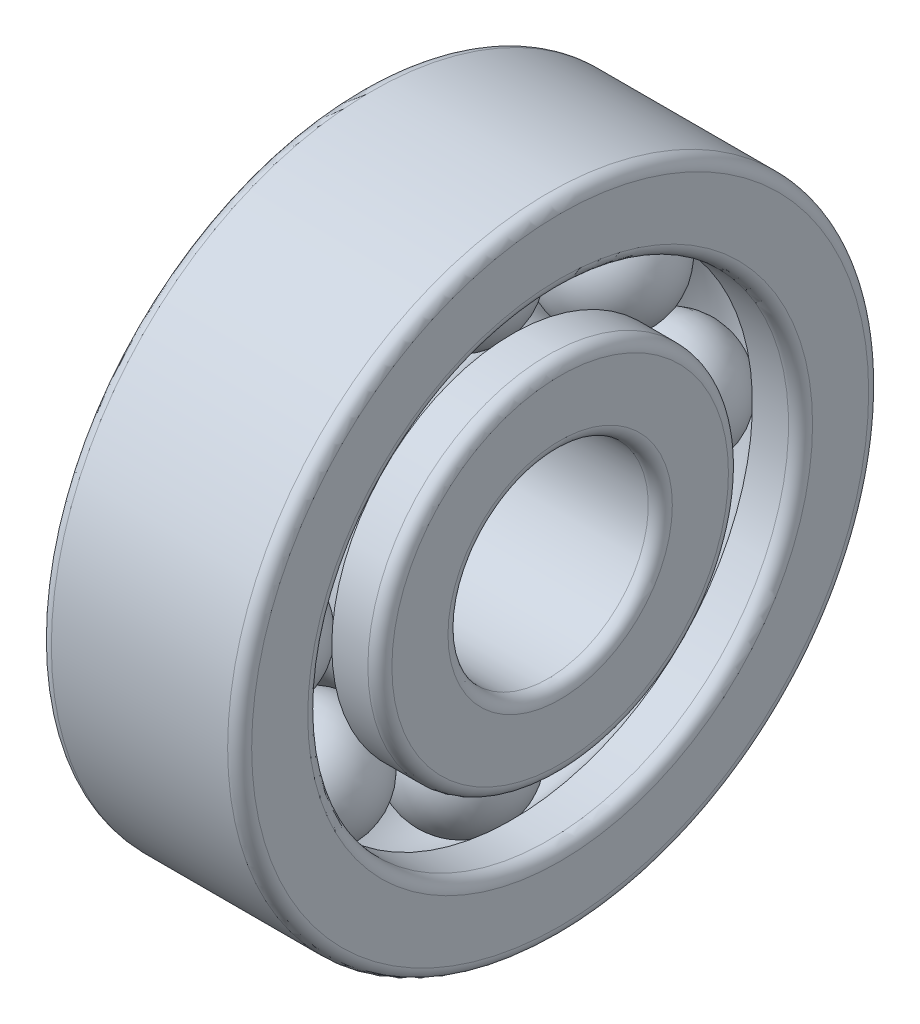
ISO-10303-21;
HEADER;
FILE_DESCRIPTION(('STEP AP214'),'2;1');
FILE_NAME('part.step','',(''),(''),'','','');
FILE_SCHEMA(('AUTOMOTIVE_DESIGN { 1 0 10303 214 1 1 1 1 }'));
ENDSEC;
DATA;
#1=APPLICATION_CONTEXT('core data for automotive mechanical design processes');
#2=APPLICATION_PROTOCOL_DEFINITION('international standard','automotive_design',2000,#1);
#3=PRODUCT_CONTEXT('',#1,'mechanical');
#4=PRODUCT('Part','Part','',(#3));
#5=PRODUCT_RELATED_PRODUCT_CATEGORY('part','',(#4));
#6=PRODUCT_DEFINITION_FORMATION('','',#4);
#7=PRODUCT_DEFINITION_CONTEXT('part definition',#1,'design');
#8=PRODUCT_DEFINITION('design','',#6,#7);
#9=PRODUCT_DEFINITION_SHAPE('','',#8);
#10=(LENGTH_UNIT() NAMED_UNIT(*) SI_UNIT(.MILLI.,.METRE.));
#11=(NAMED_UNIT(*) PLANE_ANGLE_UNIT() SI_UNIT($,.RADIAN.));
#12=(NAMED_UNIT(*) SI_UNIT($,.STERADIAN.) SOLID_ANGLE_UNIT());
#13=UNCERTAINTY_MEASURE_WITH_UNIT(LENGTH_MEASURE(1.E-05),#10,'distance_accuracy_value','');
#14=(GEOMETRIC_REPRESENTATION_CONTEXT(3) GLOBAL_UNCERTAINTY_ASSIGNED_CONTEXT((#13)) GLOBAL_UNIT_ASSIGNED_CONTEXT((#10,
#11,#12)) REPRESENTATION_CONTEXT('',''));
#15=CARTESIAN_POINT('',(0.,0.,0.));
#16=DIRECTION('',(0.,0.,1.));
#17=DIRECTION('',(1.,0.,0.));
#18=AXIS2_PLACEMENT_3D('',#15,#16,#17);
#19=CARTESIAN_POINT('',(0.,0.,5.25));
#20=DIRECTION('',(0.,0.,1.));
#21=DIRECTION('',(0.,-1.,0.));
#22=AXIS2_PLACEMENT_3D('',#19,#20,#21);
#23=SPHERICAL_SURFACE('',#22,1.5);
#24=CARTESIAN_POINT('',(0.,0.,6.75));
#25=VERTEX_POINT('',#24);
#26=VERTEX_LOOP('',#25);
#27=FACE_BOUND('',#26,.T.);
#28=CARTESIAN_POINT('',(0.,0.,3.75));
#29=VERTEX_POINT('',#28);
#30=VERTEX_LOOP('',#29);
#31=FACE_BOUND('',#30,.T.);
#32=ADVANCED_FACE('P0_F15',(#27,#31),#23,.T.);
#33=CLOSED_SHELL('',(#32));
#34=MANIFOLD_SOLID_BREP('P0_B1',#33);
#35=CARTESIAN_POINT('',(0.,0.,0.));
#36=DIRECTION('',(-1.,0.,0.));
#37=DIRECTION('',(0.,0.,1.));
#38=AXIS2_PLACEMENT_3D('',#35,#36,#37);
#39=TOROIDAL_SURFACE('',#38,5.25,1.5);
#40=CARTESIAN_POINT('',(-1.29903810567666,0.,0.));
#41=DIRECTION('',(-1.,0.,0.));
#42=DIRECTION('',(0.,0.,1.));
#43=AXIS2_PLACEMENT_3D('',#40,#41,#42);
#44=CIRCLE('',#43,4.5);
#45=CARTESIAN_POINT('',(-1.29903810567666,0.,4.5));
#46=VERTEX_POINT('',#45);
#47=EDGE_CURVE('P1_E128',#46,#46,#44,.T.);
#48=ORIENTED_EDGE('',*,*,#47,.F.);
#49=EDGE_LOOP('',(#48));
#50=FACE_BOUND('',#49,.T.);
#51=CARTESIAN_POINT('',(1.29903810567666,0.,0.));
#52=DIRECTION('',(-1.,0.,0.));
#53=DIRECTION('',(0.,0.,1.));
#54=AXIS2_PLACEMENT_3D('',#51,#52,#53);
#55=CIRCLE('',#54,4.5);
#56=CARTESIAN_POINT('',(1.29903810567666,0.,4.5));
#57=VERTEX_POINT('',#56);
#58=EDGE_CURVE('P1_E123',#57,#57,#55,.F.);
#59=ORIENTED_EDGE('',*,*,#58,.F.);
#60=EDGE_LOOP('',(#59));
#61=FACE_BOUND('',#60,.T.);
#62=ADVANCED_FACE('P1_F16',(#50,#61),#39,.F.);
#63=CARTESIAN_POINT('',(-4.15496409017378,0.,0.));
#64=DIRECTION('',(-1.,0.,0.));
#65=DIRECTION('',(0.,0.,1.));
#66=AXIS2_PLACEMENT_3D('',#63,#64,#65);
#67=CYLINDRICAL_SURFACE('',#66,4.5);
#68=ORIENTED_EDGE('',*,*,#47,.T.);
#69=EDGE_LOOP('',(#68));
#70=FACE_BOUND('',#69,.T.);
#71=CARTESIAN_POINT('',(-2.2,0.,0.));
#72=DIRECTION('',(1.,0.,0.));
#73=DIRECTION('',(0.,0.,-1.));
#74=AXIS2_PLACEMENT_3D('',#71,#72,#73);
#75=CIRCLE('',#74,4.5);
#76=CARTESIAN_POINT('',(-2.2,0.,-4.5));
#77=VERTEX_POINT('',#76);
#78=EDGE_CURVE('P1_E121',#77,#77,#75,.F.);
#79=ORIENTED_EDGE('',*,*,#78,.F.);
#80=EDGE_LOOP('',(#79));
#81=FACE_BOUND('',#80,.T.);
#82=ADVANCED_FACE('P1_F224',(#70,#81),#67,.T.);
#83=CARTESIAN_POINT('',(-4.15496409017378,0.,0.));
#84=DIRECTION('',(-1.,0.,0.));
#85=DIRECTION('',(0.,0.,1.));
#86=AXIS2_PLACEMENT_3D('',#83,#84,#85);
#87=CYLINDRICAL_SURFACE('',#86,4.5);
#88=CARTESIAN_POINT('',(2.2,0.,0.));
#89=DIRECTION('',(-1.,0.,0.));
#90=DIRECTION('',(0.,0.,1.));
#91=AXIS2_PLACEMENT_3D('',#88,#89,#90);
#92=CIRCLE('',#91,4.5);
#93=CARTESIAN_POINT('',(2.2,0.,4.5));
#94=VERTEX_POINT('',#93);
#95=EDGE_CURVE('P1_E70',#94,#94,#92,.F.);
#96=ORIENTED_EDGE('',*,*,#95,.F.);
#97=EDGE_LOOP('',(#96));
#98=FACE_BOUND('',#97,.T.);
#99=ORIENTED_EDGE('',*,*,#58,.T.);
#100=EDGE_LOOP('',(#99));
#101=FACE_BOUND('',#100,.T.);
#102=ADVANCED_FACE('P1_F221',(#98,#101),#87,.T.);
#103=CARTESIAN_POINT('',(-2.2,0.,0.));
#104=DIRECTION('',(1.,0.,0.));
#105=DIRECTION('',(0.,0.,-1.));
#106=AXIS2_PLACEMENT_3D('',#103,#104,#105);
#107=TOROIDAL_SURFACE('',#106,4.2,0.3);
#108=CARTESIAN_POINT('',(-2.5,0.,0.));
#109=DIRECTION('',(1.,0.,0.));
#110=DIRECTION('',(0.,0.,-1.));
#111=AXIS2_PLACEMENT_3D('',#108,#109,#110);
#112=CIRCLE('',#111,4.2);
#113=CARTESIAN_POINT('',(-2.5,0.,-4.2));
#114=VERTEX_POINT('',#113);
#115=CARTESIAN_POINT('',(-2.5,0.,4.2));
#116=VERTEX_POINT('',#115);
#117=EDGE_CURVE('P1_E57',#114,#116,#112,.T.);
#118=ORIENTED_EDGE('',*,*,#117,.T.);
#119=CARTESIAN_POINT('',(-2.5,0.,0.));
#120=DIRECTION('',(1.,0.,0.));
#121=DIRECTION('',(0.,0.,1.));
#122=AXIS2_PLACEMENT_3D('',#119,#120,#121);
#123=CIRCLE('',#122,4.2);
#124=EDGE_CURVE('P1_E60',#116,#114,#123,.T.);
#125=ORIENTED_EDGE('',*,*,#124,.T.);
#126=EDGE_LOOP('',(#118,#125));
#127=FACE_BOUND('',#126,.T.);
#128=ORIENTED_EDGE('',*,*,#78,.T.);
#129=EDGE_LOOP('',(#128));
#130=FACE_BOUND('',#129,.T.);
#131=ADVANCED_FACE('P1_F68',(#127,#130),#107,.T.);
#132=CARTESIAN_POINT('',(2.2,0.,0.));
#133=DIRECTION('',(-1.,0.,0.));
#134=DIRECTION('',(0.,0.,1.));
#135=AXIS2_PLACEMENT_3D('',#132,#133,#134);
#136=TOROIDAL_SURFACE('',#135,4.2,0.3);
#137=CARTESIAN_POINT('',(2.5,0.,0.));
#138=DIRECTION('',(-1.,0.,0.));
#139=DIRECTION('',(0.,0.,1.));
#140=AXIS2_PLACEMENT_3D('',#137,#138,#139);
#141=CIRCLE('',#140,4.2);
#142=CARTESIAN_POINT('',(2.5,0.,4.2));
#143=VERTEX_POINT('',#142);
#144=CARTESIAN_POINT('',(2.5,0.,-4.2));
#145=VERTEX_POINT('',#144);
#146=EDGE_CURVE('P1_E161',#143,#145,#141,.T.);
#147=ORIENTED_EDGE('',*,*,#146,.T.);
#148=CARTESIAN_POINT('',(2.5,0.,0.));
#149=DIRECTION('',(-1.,0.,0.));
#150=DIRECTION('',(0.,0.,-1.));
#151=AXIS2_PLACEMENT_3D('',#148,#149,#150);
#152=CIRCLE('',#151,4.2);
#153=EDGE_CURVE('P1_E101',#145,#143,#152,.T.);
#154=ORIENTED_EDGE('',*,*,#153,.T.);
#155=EDGE_LOOP('',(#147,#154));
#156=FACE_BOUND('',#155,.T.);
#157=ORIENTED_EDGE('',*,*,#95,.T.);
#158=EDGE_LOOP('',(#157));
#159=FACE_BOUND('',#158,.T.);
#160=ADVANCED_FACE('P1_F78',(#156,#159),#136,.T.);
#161=CARTESIAN_POINT('',(-2.5,2.5,0.));
#162=DIRECTION('',(1.,0.,0.));
#163=DIRECTION('',(0.,0.,-1.));
#164=AXIS2_PLACEMENT_3D('',#161,#162,#163);
#165=PLANE('',#164);
#166=CARTESIAN_POINT('',(-2.5,0.,0.));
#167=DIRECTION('',(-1.,0.,0.));
#168=DIRECTION('',(0.,0.,-1.));
#169=AXIS2_PLACEMENT_3D('',#166,#167,#168);
#170=CIRCLE('',#169,2.8);
#171=CARTESIAN_POINT('',(-2.5,0.,-2.8));
#172=VERTEX_POINT('',#171);
#173=CARTESIAN_POINT('',(-2.5,0.,2.8));
#174=VERTEX_POINT('',#173);
#175=EDGE_CURVE('P1_E215',#172,#174,#170,.T.);
#176=ORIENTED_EDGE('',*,*,#175,.F.);
#177=CARTESIAN_POINT('',(-2.5,0.,0.));
#178=DIRECTION('',(-1.,0.,0.));
#179=DIRECTION('',(0.,0.,1.));
#180=AXIS2_PLACEMENT_3D('',#177,#178,#179);
#181=CIRCLE('',#180,2.8);
#182=EDGE_CURVE('P1_E65',#174,#172,#181,.T.);
#183=ORIENTED_EDGE('',*,*,#182,.F.);
#184=EDGE_LOOP('',(#176,#183));
#185=FACE_BOUND('',#184,.T.);
#186=ORIENTED_EDGE('',*,*,#117,.F.);
#187=ORIENTED_EDGE('',*,*,#124,.F.);
#188=EDGE_LOOP('',(#186,#187));
#189=FACE_BOUND('',#188,.T.);
#190=ADVANCED_FACE('P1_F62',(#185,#189),#165,.F.);
#191=CARTESIAN_POINT('',(2.5,2.5,0.));
#192=DIRECTION('',(-1.,0.,0.));
#193=DIRECTION('',(0.,0.,1.));
#194=AXIS2_PLACEMENT_3D('',#191,#192,#193);
#195=PLANE('',#194);
#196=CARTESIAN_POINT('',(2.5,0.,0.));
#197=DIRECTION('',(1.,0.,0.));
#198=DIRECTION('',(0.,0.,1.));
#199=AXIS2_PLACEMENT_3D('',#196,#197,#198);
#200=CIRCLE('',#199,2.8);
#201=CARTESIAN_POINT('',(2.5,0.,2.8));
#202=VERTEX_POINT('',#201);
#203=CARTESIAN_POINT('',(2.5,0.,-2.8));
#204=VERTEX_POINT('',#203);
#205=EDGE_CURVE('P1_E181',#202,#204,#200,.T.);
#206=ORIENTED_EDGE('',*,*,#205,.F.);
#207=CARTESIAN_POINT('',(2.5,0.,0.));
#208=DIRECTION('',(1.,0.,0.));
#209=DIRECTION('',(0.,0.,-1.));
#210=AXIS2_PLACEMENT_3D('',#207,#208,#209);
#211=CIRCLE('',#210,2.8);
#212=EDGE_CURVE('P1_E36',#204,#202,#211,.T.);
#213=ORIENTED_EDGE('',*,*,#212,.F.);
#214=EDGE_LOOP('',(#206,#213));
#215=FACE_BOUND('',#214,.T.);
#216=ORIENTED_EDGE('',*,*,#146,.F.);
#217=ORIENTED_EDGE('',*,*,#153,.F.);
#218=EDGE_LOOP('',(#216,#217));
#219=FACE_BOUND('',#218,.T.);
#220=ADVANCED_FACE('P1_F149',(#215,#219),#195,.F.);
#221=CARTESIAN_POINT('',(-2.2,0.,0.));
#222=DIRECTION('',(1.,0.,0.));
#223=DIRECTION('',(0.,0.,-1.));
#224=AXIS2_PLACEMENT_3D('',#221,#222,#223);
#225=TOROIDAL_SURFACE('',#224,2.8,0.3);
#226=CARTESIAN_POINT('',(-2.2,0.,0.));
#227=DIRECTION('',(-1.,0.,0.));
#228=DIRECTION('',(0.,0.,1.));
#229=AXIS2_PLACEMENT_3D('',#226,#227,#228);
#230=CIRCLE('',#229,2.5);
#231=CARTESIAN_POINT('',(-2.2,0.,2.5));
#232=VERTEX_POINT('',#231);
#233=EDGE_CURVE('P1_E28',#232,#232,#230,.F.);
#234=ORIENTED_EDGE('',*,*,#233,.T.);
#235=EDGE_LOOP('',(#234));
#236=FACE_BOUND('',#235,.T.);
#237=ORIENTED_EDGE('',*,*,#175,.T.);
#238=ORIENTED_EDGE('',*,*,#182,.T.);
#239=EDGE_LOOP('',(#237,#238));
#240=FACE_BOUND('',#239,.T.);
#241=ADVANCED_FACE('P1_F138',(#236,#240),#225,.T.);
#242=CARTESIAN_POINT('',(2.2,0.,0.));
#243=DIRECTION('',(-1.,0.,0.));
#244=DIRECTION('',(0.,0.,1.));
#245=AXIS2_PLACEMENT_3D('',#242,#243,#244);
#246=TOROIDAL_SURFACE('',#245,2.8,0.3);
#247=ORIENTED_EDGE('',*,*,#205,.T.);
#248=ORIENTED_EDGE('',*,*,#212,.T.);
#249=EDGE_LOOP('',(#247,#248));
#250=FACE_BOUND('',#249,.T.);
#251=CARTESIAN_POINT('',(2.2,0.,0.));
#252=DIRECTION('',(-1.,0.,0.));
#253=DIRECTION('',(0.,0.,1.));
#254=AXIS2_PLACEMENT_3D('',#251,#252,#253);
#255=CIRCLE('',#254,2.5);
#256=CARTESIAN_POINT('',(2.2,0.,2.5));
#257=VERTEX_POINT('',#256);
#258=EDGE_CURVE('P1_E11',#257,#257,#255,.T.);
#259=ORIENTED_EDGE('',*,*,#258,.T.);
#260=EDGE_LOOP('',(#259));
#261=FACE_BOUND('',#260,.T.);
#262=ADVANCED_FACE('P1_F148',(#250,#261),#246,.T.);
#263=CARTESIAN_POINT('',(-4.15496409017378,0.,0.));
#264=DIRECTION('',(-1.,0.,0.));
#265=DIRECTION('',(0.,0.,1.));
#266=AXIS2_PLACEMENT_3D('',#263,#264,#265);
#267=CYLINDRICAL_SURFACE('',#266,2.5);
#268=ORIENTED_EDGE('',*,*,#233,.F.);
#269=EDGE_LOOP('',(#268));
#270=FACE_BOUND('',#269,.T.);
#271=ORIENTED_EDGE('',*,*,#258,.F.);
#272=EDGE_LOOP('',(#271));
#273=FACE_BOUND('',#272,.T.);
#274=ADVANCED_FACE('P1_F235',(#270,#273),#267,.F.);
#275=CLOSED_SHELL('',(#62,#82,#102,#131,#160,#190,#220,#241,#262,#274));
#276=MANIFOLD_SOLID_BREP('P1_B1',#275);
#277=CARTESIAN_POINT('',(0.,-5.25,0.));
#278=DIRECTION('',(0.,-1.,0.));
#279=DIRECTION('',(0.,0.,-1.));
#280=AXIS2_PLACEMENT_3D('',#277,#278,#279);
#281=SPHERICAL_SURFACE('',#280,1.5);
#282=CARTESIAN_POINT('',(0.,-3.75,0.));
#283=VERTEX_POINT('',#282);
#284=VERTEX_LOOP('',#283);
#285=FACE_BOUND('',#284,.T.);
#286=CARTESIAN_POINT('',(0.,-6.75,0.));
#287=VERTEX_POINT('',#286);
#288=VERTEX_LOOP('',#287);
#289=FACE_BOUND('',#288,.T.);
#290=ADVANCED_FACE('P2_F15',(#285,#289),#281,.T.);
#291=CLOSED_SHELL('',(#290));
#292=MANIFOLD_SOLID_BREP('P2_B1',#291);
#293=CARTESIAN_POINT('',(0.,0.,-5.25));
#294=DIRECTION('',(0.,0.,-1.));
#295=DIRECTION('',(0.,1.,0.));
#296=AXIS2_PLACEMENT_3D('',#293,#294,#295);
#297=SPHERICAL_SURFACE('',#296,1.5);
#298=CARTESIAN_POINT('',(0.,0.,-6.75));
#299=VERTEX_POINT('',#298);
#300=VERTEX_LOOP('',#299);
#301=FACE_BOUND('',#300,.T.);
#302=CARTESIAN_POINT('',(0.,0.,-3.75));
#303=VERTEX_POINT('',#302);
#304=VERTEX_LOOP('',#303);
#305=FACE_BOUND('',#304,.T.);
#306=ADVANCED_FACE('P3_F15',(#301,#305),#297,.T.);
#307=CLOSED_SHELL('',(#306));
#308=MANIFOLD_SOLID_BREP('P3_B1',#307);
#309=CARTESIAN_POINT('',(0.,-3.71231060122939,3.71231060122936));
#310=DIRECTION('',(0.,-0.707106781186551,0.707106781186544));
#311=DIRECTION('',(0.,-0.707106781186544,-0.707106781186551));
#312=AXIS2_PLACEMENT_3D('',#309,#310,#311);
#313=SPHERICAL_SURFACE('',#312,1.5);
#314=CARTESIAN_POINT('',(0.,-2.65165042944956,2.65165042944954));
#315=VERTEX_POINT('',#314);
#316=VERTEX_LOOP('',#315);
#317=FACE_BOUND('',#316,.T.);
#318=CARTESIAN_POINT('',(0.,-4.77297077300922,4.77297077300917));
#319=VERTEX_POINT('',#318);
#320=VERTEX_LOOP('',#319);
#321=FACE_BOUND('',#320,.T.);
#322=ADVANCED_FACE('P4_F15',(#317,#321),#313,.T.);
#323=CLOSED_SHELL('',(#322));
#324=MANIFOLD_SOLID_BREP('P4_B1',#323);
#325=CARTESIAN_POINT('',(0.,3.71231060122937,3.71231060122938));
#326=DIRECTION('',(0.,0.707106781186546,0.707106781186549));
#327=DIRECTION('',(0.,-0.707106781186549,0.707106781186546));
#328=AXIS2_PLACEMENT_3D('',#325,#326,#327);
#329=SPHERICAL_SURFACE('',#328,1.5);
#330=CARTESIAN_POINT('',(0.,4.77297077300919,4.7729707730092));
#331=VERTEX_POINT('',#330);
#332=VERTEX_LOOP('',#331);
#333=FACE_BOUND('',#332,.T.);
#334=CARTESIAN_POINT('',(0.,2.65165042944955,2.65165042944956));
#335=VERTEX_POINT('',#334);
#336=VERTEX_LOOP('',#335);
#337=FACE_BOUND('',#336,.T.);
#338=ADVANCED_FACE('P5_F15',(#333,#337),#329,.T.);
#339=CLOSED_SHELL('',(#338));
#340=MANIFOLD_SOLID_BREP('P5_B1',#339);
#341=CARTESIAN_POINT('',(0.,3.71231060122942,-3.71231060122933));
#342=DIRECTION('',(0.,0.707106781186556,-0.707106781186539));
#343=DIRECTION('',(0.,0.707106781186539,0.707106781186556));
#344=AXIS2_PLACEMENT_3D('',#341,#342,#343);
#345=SPHERICAL_SURFACE('',#344,1.5);
#346=CARTESIAN_POINT('',(0.,2.65165042944959,-2.65165042944952));
#347=VERTEX_POINT('',#346);
#348=VERTEX_LOOP('',#347);
#349=FACE_BOUND('',#348,.T.);
#350=CARTESIAN_POINT('',(0.,4.77297077300926,-4.77297077300914));
#351=VERTEX_POINT('',#350);
#352=VERTEX_LOOP('',#351);
#353=FACE_BOUND('',#352,.T.);
#354=ADVANCED_FACE('P6_F15',(#349,#353),#345,.T.);
#355=CLOSED_SHELL('',(#354));
#356=MANIFOLD_SOLID_BREP('P6_B1',#355);
#357=CARTESIAN_POINT('',(0.,5.25,0.));
#358=DIRECTION('',(0.,1.,0.));
#359=DIRECTION('',(0.,0.,1.));
#360=AXIS2_PLACEMENT_3D('',#357,#358,#359);
#361=SPHERICAL_SURFACE('',#360,1.5);
#362=CARTESIAN_POINT('',(0.,3.75,0.));
#363=VERTEX_POINT('',#362);
#364=VERTEX_LOOP('',#363);
#365=FACE_BOUND('',#364,.T.);
#366=CARTESIAN_POINT('',(0.,6.75,0.));
#367=VERTEX_POINT('',#366);
#368=VERTEX_LOOP('',#367);
#369=FACE_BOUND('',#368,.T.);
#370=ADVANCED_FACE('P7_F15',(#365,#369),#361,.T.);
#371=CLOSED_SHELL('',(#370));
#372=MANIFOLD_SOLID_BREP('P7_B1',#371);
#373=CARTESIAN_POINT('',(0.,0.,0.));
#374=DIRECTION('',(-1.,0.,0.));
#375=DIRECTION('',(0.,0.,1.));
#376=AXIS2_PLACEMENT_3D('',#373,#374,#375);
#377=TOROIDAL_SURFACE('',#376,5.25,1.5);
#378=CARTESIAN_POINT('',(1.29903810567666,0.,0.));
#379=DIRECTION('',(-1.,0.,0.));
#380=DIRECTION('',(0.,0.,1.));
#381=AXIS2_PLACEMENT_3D('',#378,#379,#380);
#382=CIRCLE('',#381,6.);
#383=CARTESIAN_POINT('',(1.29903810567666,0.,6.));
#384=VERTEX_POINT('',#383);
#385=EDGE_CURVE('P8_E126',#384,#384,#382,.F.);
#386=ORIENTED_EDGE('',*,*,#385,.T.);
#387=EDGE_LOOP('',(#386));
#388=FACE_BOUND('',#387,.T.);
#389=CARTESIAN_POINT('',(-1.29903810567666,0.,0.));
#390=DIRECTION('',(-1.,0.,0.));
#391=DIRECTION('',(0.,0.,1.));
#392=AXIS2_PLACEMENT_3D('',#389,#390,#391);
#393=CIRCLE('',#392,6.);
#394=CARTESIAN_POINT('',(-1.29903810567666,0.,6.));
#395=VERTEX_POINT('',#394);
#396=EDGE_CURVE('P8_E219',#395,#395,#393,.T.);
#397=ORIENTED_EDGE('',*,*,#396,.T.);
#398=EDGE_LOOP('',(#397));
#399=FACE_BOUND('',#398,.T.);
#400=ADVANCED_FACE('P8_F16',(#388,#399),#377,.F.);
#401=CARTESIAN_POINT('',(-4.15496409017378,0.,0.));
#402=DIRECTION('',(-1.,0.,0.));
#403=DIRECTION('',(0.,0.,1.));
#404=AXIS2_PLACEMENT_3D('',#401,#402,#403);
#405=CYLINDRICAL_SURFACE('',#404,6.);
#406=CARTESIAN_POINT('',(2.2,0.,0.));
#407=DIRECTION('',(-1.,0.,0.));
#408=DIRECTION('',(0.,0.,1.));
#409=AXIS2_PLACEMENT_3D('',#406,#407,#408);
#410=CIRCLE('',#409,6.);
#411=CARTESIAN_POINT('',(2.2,0.,6.));
#412=VERTEX_POINT('',#411);
#413=EDGE_CURVE('P8_E216',#412,#412,#410,.T.);
#414=ORIENTED_EDGE('',*,*,#413,.F.);
#415=EDGE_LOOP('',(#414));
#416=FACE_BOUND('',#415,.T.);
#417=ORIENTED_EDGE('',*,*,#385,.F.);
#418=EDGE_LOOP('',(#417));
#419=FACE_BOUND('',#418,.T.);
#420=ADVANCED_FACE('P8_F233',(#416,#419),#405,.F.);
#421=CARTESIAN_POINT('',(-4.15496409017378,0.,0.));
#422=DIRECTION('',(-1.,0.,0.));
#423=DIRECTION('',(0.,0.,1.));
#424=AXIS2_PLACEMENT_3D('',#421,#422,#423);
#425=CYLINDRICAL_SURFACE('',#424,6.);
#426=ORIENTED_EDGE('',*,*,#396,.F.);
#427=EDGE_LOOP('',(#426));
#428=FACE_BOUND('',#427,.T.);
#429=CARTESIAN_POINT('',(-2.2,0.,0.));
#430=DIRECTION('',(1.,0.,0.));
#431=DIRECTION('',(0.,0.,-1.));
#432=AXIS2_PLACEMENT_3D('',#429,#430,#431);
#433=CIRCLE('',#432,6.);
#434=CARTESIAN_POINT('',(-2.2,0.,-6.));
#435=VERTEX_POINT('',#434);
#436=EDGE_CURVE('P8_E65',#435,#435,#433,.T.);
#437=ORIENTED_EDGE('',*,*,#436,.F.);
#438=EDGE_LOOP('',(#437));
#439=FACE_BOUND('',#438,.T.);
#440=ADVANCED_FACE('P8_F235',(#428,#439),#425,.F.);
#441=CARTESIAN_POINT('',(2.2,0.,0.));
#442=DIRECTION('',(-1.,0.,0.));
#443=DIRECTION('',(0.,0.,1.));
#444=AXIS2_PLACEMENT_3D('',#441,#442,#443);
#445=TOROIDAL_SURFACE('',#444,6.3,0.3);
#446=CARTESIAN_POINT('',(2.5,0.,0.));
#447=DIRECTION('',(1.,0.,0.));
#448=DIRECTION('',(0.,0.,1.));
#449=AXIS2_PLACEMENT_3D('',#446,#447,#448);
#450=CIRCLE('',#449,6.3);
#451=CARTESIAN_POINT('',(2.5,0.,6.3));
#452=VERTEX_POINT('',#451);
#453=CARTESIAN_POINT('',(2.5,0.,-6.3));
#454=VERTEX_POINT('',#453);
#455=EDGE_CURVE('P8_E60',#452,#454,#450,.T.);
#456=ORIENTED_EDGE('',*,*,#455,.T.);
#457=CARTESIAN_POINT('',(2.5,0.,0.));
#458=DIRECTION('',(1.,0.,0.));
#459=DIRECTION('',(0.,0.,-1.));
#460=AXIS2_PLACEMENT_3D('',#457,#458,#459);
#461=CIRCLE('',#460,6.3);
#462=EDGE_CURVE('P8_E57',#454,#452,#461,.T.);
#463=ORIENTED_EDGE('',*,*,#462,.T.);
#464=EDGE_LOOP('',(#456,#463));
#465=FACE_BOUND('',#464,.T.);
#466=ORIENTED_EDGE('',*,*,#413,.T.);
#467=EDGE_LOOP('',(#466));
#468=FACE_BOUND('',#467,.T.);
#469=ADVANCED_FACE('P8_F61',(#465,#468),#445,.T.);
#470=CARTESIAN_POINT('',(-2.2,0.,0.));
#471=DIRECTION('',(1.,0.,0.));
#472=DIRECTION('',(0.,0.,-1.));
#473=AXIS2_PLACEMENT_3D('',#470,#471,#472);
#474=TOROIDAL_SURFACE('',#473,6.3,0.3);
#475=CARTESIAN_POINT('',(-2.5,0.,0.));
#476=DIRECTION('',(-1.,0.,0.));
#477=DIRECTION('',(0.,0.,-1.));
#478=AXIS2_PLACEMENT_3D('',#475,#476,#477);
#479=CIRCLE('',#478,6.3);
#480=CARTESIAN_POINT('',(-2.5,0.,-6.3));
#481=VERTEX_POINT('',#480);
#482=CARTESIAN_POINT('',(-2.5,0.,6.3));
#483=VERTEX_POINT('',#482);
#484=EDGE_CURVE('P8_E70',#481,#483,#479,.T.);
#485=ORIENTED_EDGE('',*,*,#484,.T.);
#486=CARTESIAN_POINT('',(-2.5,0.,0.));
#487=DIRECTION('',(-1.,0.,0.));
#488=DIRECTION('',(0.,0.,1.));
#489=AXIS2_PLACEMENT_3D('',#486,#487,#488);
#490=CIRCLE('',#489,6.3);
#491=EDGE_CURVE('P8_E117',#483,#481,#490,.T.);
#492=ORIENTED_EDGE('',*,*,#491,.T.);
#493=EDGE_LOOP('',(#485,#492));
#494=FACE_BOUND('',#493,.T.);
#495=ORIENTED_EDGE('',*,*,#436,.T.);
#496=EDGE_LOOP('',(#495));
#497=FACE_BOUND('',#496,.T.);
#498=ADVANCED_FACE('P8_F91',(#494,#497),#474,.T.);
#499=CARTESIAN_POINT('',(2.5,6.,0.));
#500=DIRECTION('',(-1.,0.,0.));
#501=DIRECTION('',(0.,0.,1.));
#502=AXIS2_PLACEMENT_3D('',#499,#500,#501);
#503=PLANE('',#502);
#504=ORIENTED_EDGE('',*,*,#455,.F.);
#505=ORIENTED_EDGE('',*,*,#462,.F.);
#506=EDGE_LOOP('',(#504,#505));
#507=FACE_BOUND('',#506,.T.);
#508=CARTESIAN_POINT('',(2.5,0.,0.));
#509=DIRECTION('',(-1.,0.,0.));
#510=DIRECTION('',(0.,0.,1.));
#511=AXIS2_PLACEMENT_3D('',#508,#509,#510);
#512=CIRCLE('',#511,7.7);
#513=CARTESIAN_POINT('',(2.5,0.,7.7));
#514=VERTEX_POINT('',#513);
#515=CARTESIAN_POINT('',(2.5,0.,-7.7));
#516=VERTEX_POINT('',#515);
#517=EDGE_CURVE('P8_E114',#514,#516,#512,.T.);
#518=ORIENTED_EDGE('',*,*,#517,.F.);
#519=CARTESIAN_POINT('',(2.5,0.,0.));
#520=DIRECTION('',(-1.,0.,0.));
#521=DIRECTION('',(0.,0.,-1.));
#522=AXIS2_PLACEMENT_3D('',#519,#520,#521);
#523=CIRCLE('',#522,7.7);
#524=EDGE_CURVE('P8_E113',#516,#514,#523,.T.);
#525=ORIENTED_EDGE('',*,*,#524,.F.);
#526=EDGE_LOOP('',(#518,#525));
#527=FACE_BOUND('',#526,.T.);
#528=ADVANCED_FACE('P8_F68',(#507,#527),#503,.F.);
#529=CARTESIAN_POINT('',(-2.5,6.,0.));
#530=DIRECTION('',(1.,0.,0.));
#531=DIRECTION('',(0.,0.,-1.));
#532=AXIS2_PLACEMENT_3D('',#529,#530,#531);
#533=PLANE('',#532);
#534=ORIENTED_EDGE('',*,*,#484,.F.);
#535=ORIENTED_EDGE('',*,*,#491,.F.);
#536=EDGE_LOOP('',(#534,#535));
#537=FACE_BOUND('',#536,.T.);
#538=CARTESIAN_POINT('',(-2.5,0.,0.));
#539=DIRECTION('',(1.,0.,0.));
#540=DIRECTION('',(0.,0.,-1.));
#541=AXIS2_PLACEMENT_3D('',#538,#539,#540);
#542=CIRCLE('',#541,7.7);
#543=CARTESIAN_POINT('',(-2.5,0.,-7.7));
#544=VERTEX_POINT('',#543);
#545=CARTESIAN_POINT('',(-2.5,0.,7.7));
#546=VERTEX_POINT('',#545);
#547=EDGE_CURVE('P8_E119',#544,#546,#542,.T.);
#548=ORIENTED_EDGE('',*,*,#547,.F.);
#549=CARTESIAN_POINT('',(-2.5,0.,0.));
#550=DIRECTION('',(1.,0.,0.));
#551=DIRECTION('',(0.,0.,1.));
#552=AXIS2_PLACEMENT_3D('',#549,#550,#551);
#553=CIRCLE('',#552,7.7);
#554=EDGE_CURVE('P8_E36',#546,#544,#553,.T.);
#555=ORIENTED_EDGE('',*,*,#554,.F.);
#556=EDGE_LOOP('',(#548,#555));
#557=FACE_BOUND('',#556,.T.);
#558=ADVANCED_FACE('P8_F90',(#537,#557),#533,.F.);
#559=CARTESIAN_POINT('',(2.2,0.,0.));
#560=DIRECTION('',(-1.,0.,0.));
#561=DIRECTION('',(0.,0.,1.));
#562=AXIS2_PLACEMENT_3D('',#559,#560,#561);
#563=TOROIDAL_SURFACE('',#562,7.7,0.3);
#564=CARTESIAN_POINT('',(2.2,0.,0.));
#565=DIRECTION('',(-1.,0.,0.));
#566=DIRECTION('',(0.,0.,1.));
#567=AXIS2_PLACEMENT_3D('',#564,#565,#566);
#568=CIRCLE('',#567,8.);
#569=CARTESIAN_POINT('',(2.2,0.,8.));
#570=VERTEX_POINT('',#569);
#571=EDGE_CURVE('P8_E28',#570,#570,#568,.T.);
#572=ORIENTED_EDGE('',*,*,#571,.F.);
#573=EDGE_LOOP('',(#572));
#574=FACE_BOUND('',#573,.T.);
#575=ORIENTED_EDGE('',*,*,#517,.T.);
#576=ORIENTED_EDGE('',*,*,#524,.T.);
#577=EDGE_LOOP('',(#575,#576));
#578=FACE_BOUND('',#577,.T.);
#579=ADVANCED_FACE('P8_F118',(#574,#578),#563,.T.);
#580=CARTESIAN_POINT('',(-2.2,0.,0.));
#581=DIRECTION('',(1.,0.,0.));
#582=DIRECTION('',(0.,0.,-1.));
#583=AXIS2_PLACEMENT_3D('',#580,#581,#582);
#584=TOROIDAL_SURFACE('',#583,7.7,0.3);
#585=CARTESIAN_POINT('',(-2.2,0.,0.));
#586=DIRECTION('',(-1.,0.,0.));
#587=DIRECTION('',(0.,0.,1.));
#588=AXIS2_PLACEMENT_3D('',#585,#586,#587);
#589=CIRCLE('',#588,8.);
#590=CARTESIAN_POINT('',(-2.2,0.,8.));
#591=VERTEX_POINT('',#590);
#592=EDGE_CURVE('P8_E11',#591,#591,#589,.F.);
#593=ORIENTED_EDGE('',*,*,#592,.F.);
#594=EDGE_LOOP('',(#593));
#595=FACE_BOUND('',#594,.T.);
#596=ORIENTED_EDGE('',*,*,#547,.T.);
#597=ORIENTED_EDGE('',*,*,#554,.T.);
#598=EDGE_LOOP('',(#596,#597));
#599=FACE_BOUND('',#598,.T.);
#600=ADVANCED_FACE('P8_F122',(#595,#599),#584,.T.);
#601=CARTESIAN_POINT('',(-4.15496409017378,0.,0.));
#602=DIRECTION('',(-1.,0.,0.));
#603=DIRECTION('',(0.,0.,1.));
#604=AXIS2_PLACEMENT_3D('',#601,#602,#603);
#605=CYLINDRICAL_SURFACE('',#604,8.);
#606=ORIENTED_EDGE('',*,*,#592,.T.);
#607=EDGE_LOOP('',(#606));
#608=FACE_BOUND('',#607,.T.);
#609=ORIENTED_EDGE('',*,*,#571,.T.);
#610=EDGE_LOOP('',(#609));
#611=FACE_BOUND('',#610,.T.);
#612=ADVANCED_FACE('P8_F140',(#608,#611),#605,.T.);
#613=CLOSED_SHELL('',(#400,#420,#440,#469,#498,#528,#558,#579,#600,#612));
#614=MANIFOLD_SOLID_BREP('P8_B1',#613);
#615=CARTESIAN_POINT('',(0.,-3.71231060122934,-3.71231060122941));
#616=DIRECTION('',(0.,-0.707106781186541,-0.707106781186554));
#617=DIRECTION('',(0.,0.707106781186554,-0.707106781186541));
#618=AXIS2_PLACEMENT_3D('',#615,#616,#617);
#619=SPHERICAL_SURFACE('',#618,1.5);
#620=CARTESIAN_POINT('',(0.,-2.65165042944953,-2.65165042944957));
#621=VERTEX_POINT('',#620);
#622=VERTEX_LOOP('',#621);
#623=FACE_BOUND('',#622,.T.);
#624=CARTESIAN_POINT('',(0.,-4.77297077300915,-4.77297077300924));
#625=VERTEX_POINT('',#624);
#626=VERTEX_LOOP('',#625);
#627=FACE_BOUND('',#626,.T.);
#628=ADVANCED_FACE('P9_F15',(#623,#627),#619,.T.);
#629=CLOSED_SHELL('',(#628));
#630=MANIFOLD_SOLID_BREP('P9_B1',#629);
#631=ADVANCED_BREP_SHAPE_REPRESENTATION('',(#18,#34,#276,#292,#308,#324,#340,#356,#372,#614,
#630),#14);
#632=SHAPE_DEFINITION_REPRESENTATION(#9,#631);
ENDSEC;
END-ISO-10303-21;
